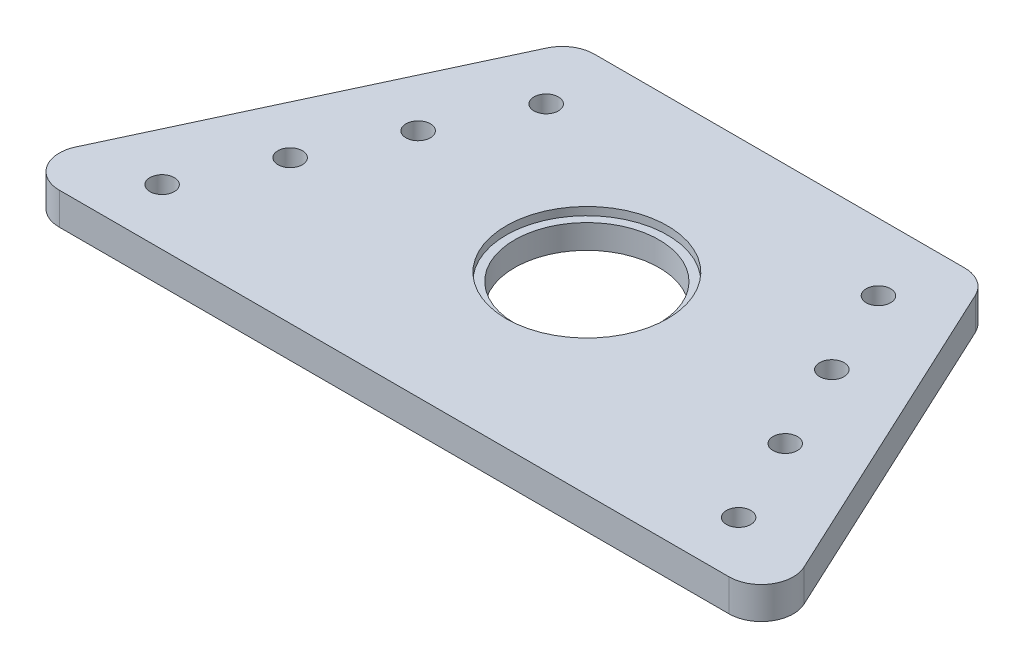
ISO-10303-21;
HEADER;
FILE_DESCRIPTION(('STEP AP214'),'2;1');
FILE_NAME('part.step','',(''),(''),'','','');
FILE_SCHEMA(('AUTOMOTIVE_DESIGN { 1 0 10303 214 1 1 1 1 }'));
ENDSEC;
DATA;
#1=APPLICATION_CONTEXT('core data for automotive mechanical design processes');
#2=APPLICATION_PROTOCOL_DEFINITION('international standard','automotive_design',2000,#1);
#3=PRODUCT_CONTEXT('',#1,'mechanical');
#4=PRODUCT('Part','Part','',(#3));
#5=PRODUCT_RELATED_PRODUCT_CATEGORY('part','',(#4));
#6=PRODUCT_DEFINITION_FORMATION('','',#4);
#7=PRODUCT_DEFINITION_CONTEXT('part definition',#1,'design');
#8=PRODUCT_DEFINITION('design','',#6,#7);
#9=PRODUCT_DEFINITION_SHAPE('','',#8);
#10=(LENGTH_UNIT() NAMED_UNIT(*) SI_UNIT(.MILLI.,.METRE.));
#11=(NAMED_UNIT(*) PLANE_ANGLE_UNIT() SI_UNIT($,.RADIAN.));
#12=(NAMED_UNIT(*) SI_UNIT($,.STERADIAN.) SOLID_ANGLE_UNIT());
#13=UNCERTAINTY_MEASURE_WITH_UNIT(LENGTH_MEASURE(1.E-05),#10,'distance_accuracy_value','');
#14=(GEOMETRIC_REPRESENTATION_CONTEXT(3) GLOBAL_UNCERTAINTY_ASSIGNED_CONTEXT((#13)) GLOBAL_UNIT_ASSIGNED_CONTEXT((#10,
#11,#12)) REPRESENTATION_CONTEXT('',''));
#15=CARTESIAN_POINT('',(0.,0.,0.));
#16=DIRECTION('',(0.,0.,1.));
#17=DIRECTION('',(1.,0.,0.));
#18=AXIS2_PLACEMENT_3D('',#15,#16,#17);
#19=CARTESIAN_POINT('',(0.,6.35,0.));
#20=DIRECTION('',(0.,-1.,0.));
#21=DIRECTION('',(0.,0.,-1.));
#22=AXIS2_PLACEMENT_3D('',#19,#20,#21);
#23=CYLINDRICAL_SURFACE('',#22,14.2875);
#24=CARTESIAN_POINT('',(0.,0.,0.));
#25=DIRECTION('',(0.,1.,0.));
#26=DIRECTION('',(0.,0.,1.));
#27=AXIS2_PLACEMENT_3D('',#24,#25,#26);
#28=CIRCLE('',#27,14.2875);
#29=CARTESIAN_POINT('',(0.,0.,14.2875));
#30=VERTEX_POINT('',#29);
#31=EDGE_CURVE('E130',#30,#30,#28,.T.);
#32=ORIENTED_EDGE('',*,*,#31,.F.);
#33=EDGE_LOOP('',(#32));
#34=FACE_BOUND('',#33,.T.);
#35=CARTESIAN_POINT('',(0.,4.7625,0.));
#36=DIRECTION('',(0.,1.,0.));
#37=DIRECTION('',(0.,0.,1.));
#38=AXIS2_PLACEMENT_3D('',#35,#36,#37);
#39=CIRCLE('',#38,14.2875);
#40=CARTESIAN_POINT('',(0.,4.7625,14.2875));
#41=VERTEX_POINT('',#40);
#42=EDGE_CURVE('E34',#41,#41,#39,.T.);
#43=ORIENTED_EDGE('',*,*,#42,.T.);
#44=EDGE_LOOP('',(#43));
#45=FACE_BOUND('',#44,.T.);
#46=ADVANCED_FACE('F30',(#34,#45),#23,.F.);
#47=CARTESIAN_POINT('',(-40.6673564485887,6.35,-38.1));
#48=DIRECTION('',(0.,-1.,0.));
#49=DIRECTION('',(0.,0.,-1.));
#50=AXIS2_PLACEMENT_3D('',#47,#48,#49);
#51=PLANE('',#50);
#52=CARTESIAN_POINT('',(0.,6.35,0.));
#53=DIRECTION('',(0.,1.,0.));
#54=DIRECTION('',(0.,0.,1.));
#55=AXIS2_PLACEMENT_3D('',#52,#53,#54);
#56=CIRCLE('',#55,15.9385);
#57=CARTESIAN_POINT('',(0.,6.35,15.9385));
#58=VERTEX_POINT('',#57);
#59=EDGE_CURVE('E226',#58,#58,#56,.T.);
#60=ORIENTED_EDGE('',*,*,#59,.F.);
#61=EDGE_LOOP('',(#60));
#62=FACE_BOUND('',#61,.T.);
#63=CARTESIAN_POINT('',(57.0052565779288,6.35,26.9875));
#64=DIRECTION('',(0.,1.,0.));
#65=DIRECTION('',(0.,0.,-1.));
#66=AXIS2_PLACEMENT_3D('',#63,#64,#65);
#67=CIRCLE('',#66,2.413);
#68=CARTESIAN_POINT('',(57.0052565779288,6.35,24.5745));
#69=VERTEX_POINT('',#68);
#70=EDGE_CURVE('E221',#69,#69,#67,.T.);
#71=ORIENTED_EDGE('',*,*,#70,.F.);
#72=EDGE_LOOP('',(#71));
#73=FACE_BOUND('',#72,.T.);
#74=CARTESIAN_POINT('',(48.9543786917679,6.35,9.72233665695194));
#75=DIRECTION('',(0.,1.,0.));
#76=DIRECTION('',(0.,0.,-1.));
#77=AXIS2_PLACEMENT_3D('',#74,#75,#76);
#78=CIRCLE('',#77,2.41299999999999);
#79=CARTESIAN_POINT('',(48.9543786917679,6.35,7.30933665695195));
#80=VERTEX_POINT('',#79);
#81=EDGE_CURVE('E215',#80,#80,#78,.T.);
#82=ORIENTED_EDGE('',*,*,#81,.F.);
#83=EDGE_LOOP('',(#82));
#84=FACE_BOUND('',#83,.T.);
#85=CARTESIAN_POINT('',(40.9035008056075,6.35,-7.5428266860962));
#86=DIRECTION('',(0.,1.,0.));
#87=DIRECTION('',(0.,0.,-1.));
#88=AXIS2_PLACEMENT_3D('',#85,#86,#87);
#89=CIRCLE('',#88,2.41299999999999);
#90=CARTESIAN_POINT('',(40.9035008056075,6.35,-9.9558266860962));
#91=VERTEX_POINT('',#90);
#92=EDGE_CURVE('E209',#91,#91,#89,.T.);
#93=ORIENTED_EDGE('',*,*,#92,.F.);
#94=EDGE_LOOP('',(#93));
#95=FACE_BOUND('',#94,.T.);
#96=CARTESIAN_POINT('',(32.8526229194476,6.35,-24.8079900291445));
#97=DIRECTION('',(0.,1.,0.));
#98=DIRECTION('',(0.,0.,-1.));
#99=AXIS2_PLACEMENT_3D('',#96,#97,#98);
#100=CIRCLE('',#99,2.413);
#101=CARTESIAN_POINT('',(32.8526229194476,6.35,-27.2209900291445));
#102=VERTEX_POINT('',#101);
#103=EDGE_CURVE('E203',#102,#102,#100,.T.);
#104=ORIENTED_EDGE('',*,*,#103,.F.);
#105=EDGE_LOOP('',(#104));
#106=FACE_BOUND('',#105,.T.);
#107=CARTESIAN_POINT('',(-32.8526229194476,6.35,-24.8079900291445));
#108=DIRECTION('',(0.,1.,0.));
#109=DIRECTION('',(0.,0.,1.));
#110=AXIS2_PLACEMENT_3D('',#107,#108,#109);
#111=CIRCLE('',#110,2.41299999999999);
#112=CARTESIAN_POINT('',(-32.8526229194476,6.35,-22.3949900291445));
#113=VERTEX_POINT('',#112);
#114=EDGE_CURVE('E197',#113,#113,#111,.T.);
#115=ORIENTED_EDGE('',*,*,#114,.F.);
#116=EDGE_LOOP('',(#115));
#117=FACE_BOUND('',#116,.T.);
#118=CARTESIAN_POINT('',(-40.9035008056075,6.35,-7.5428266860962));
#119=DIRECTION('',(0.,1.,0.));
#120=DIRECTION('',(0.,0.,1.));
#121=AXIS2_PLACEMENT_3D('',#118,#119,#120);
#122=CIRCLE('',#121,2.41299999999999);
#123=CARTESIAN_POINT('',(-40.9035008056075,6.35,-5.12982668609621));
#124=VERTEX_POINT('',#123);
#125=EDGE_CURVE('E191',#124,#124,#122,.T.);
#126=ORIENTED_EDGE('',*,*,#125,.F.);
#127=EDGE_LOOP('',(#126));
#128=FACE_BOUND('',#127,.T.);
#129=CARTESIAN_POINT('',(-48.9543786917679,6.35,9.72233665695194));
#130=DIRECTION('',(0.,1.,0.));
#131=DIRECTION('',(0.,0.,1.));
#132=AXIS2_PLACEMENT_3D('',#129,#130,#131);
#133=CIRCLE('',#132,2.41299999999999);
#134=CARTESIAN_POINT('',(-48.9543786917679,6.35,12.1353366569519));
#135=VERTEX_POINT('',#134);
#136=EDGE_CURVE('E185',#135,#135,#133,.T.);
#137=ORIENTED_EDGE('',*,*,#136,.F.);
#138=EDGE_LOOP('',(#137));
#139=FACE_BOUND('',#138,.T.);
#140=CARTESIAN_POINT('',(-57.0052565779288,6.35,26.9875));
#141=DIRECTION('',(0.,1.,0.));
#142=DIRECTION('',(0.,0.,1.));
#143=AXIS2_PLACEMENT_3D('',#140,#141,#142);
#144=CIRCLE('',#143,2.413);
#145=CARTESIAN_POINT('',(-57.0052565779288,6.35,29.4005));
#146=VERTEX_POINT('',#145);
#147=EDGE_CURVE('E179',#146,#146,#144,.T.);
#148=ORIENTED_EDGE('',*,*,#147,.F.);
#149=EDGE_LOOP('',(#148));
#150=FACE_BOUND('',#149,.T.);
#151=DIRECTION('',(-0.422618261740703,0.,0.906307787036648));
#152=VECTOR('',#151,1.);
#153=CARTESIAN_POINT('',(-76.2,6.35,38.1));
#154=LINE('',#153,#152);
#155=CARTESIAN_POINT('',(-42.3770147401438,6.35,-34.4336259620535));
#156=VERTEX_POINT('',#155);
#157=CARTESIAN_POINT('',(-71.9875510329866,6.35,29.0663740379465));
#158=VERTEX_POINT('',#157);
#159=EDGE_CURVE('E135',#156,#158,#154,.T.);
#160=ORIENTED_EDGE('',*,*,#159,.T.);
#161=CARTESIAN_POINT('',(-66.2324965853038,6.35,31.75));
#162=DIRECTION('',(0.,-1.,0.));
#163=DIRECTION('',(0.,0.,-1.));
#164=AXIS2_PLACEMENT_3D('',#161,#162,#163);
#165=CIRCLE('',#164,6.35);
#166=CARTESIAN_POINT('',(-66.2324965853038,6.35,38.1));
#167=VERTEX_POINT('',#166);
#168=EDGE_CURVE('E150',#158,#167,#165,.F.);
#169=ORIENTED_EDGE('',*,*,#168,.T.);
#170=DIRECTION('',(1.,0.,0.));
#171=VECTOR('',#170,1.);
#172=CARTESIAN_POINT('',(76.2,6.35,38.1));
#173=LINE('',#172,#171);
#174=CARTESIAN_POINT('',(66.2324965853039,6.35,38.1));
#175=VERTEX_POINT('',#174);
#176=EDGE_CURVE('E117',#167,#175,#173,.T.);
#177=ORIENTED_EDGE('',*,*,#176,.T.);
#178=CARTESIAN_POINT('',(66.2324965853039,6.35,31.75));
#179=DIRECTION('',(0.,-1.,0.));
#180=DIRECTION('',(0.,0.,-1.));
#181=AXIS2_PLACEMENT_3D('',#178,#179,#180);
#182=CIRCLE('',#181,6.35);
#183=CARTESIAN_POINT('',(71.9875510329866,6.35,29.0663740379466));
#184=VERTEX_POINT('',#183);
#185=EDGE_CURVE('E145',#175,#184,#182,.F.);
#186=ORIENTED_EDGE('',*,*,#185,.T.);
#187=DIRECTION('',(-0.422618261740703,0.,-0.906307787036648));
#188=VECTOR('',#187,1.);
#189=CARTESIAN_POINT('',(40.6673564485887,6.35,-38.1));
#190=LINE('',#189,#188);
#191=CARTESIAN_POINT('',(42.3770147401438,6.35,-34.4336259620535));
#192=VERTEX_POINT('',#191);
#193=EDGE_CURVE('E162',#184,#192,#190,.T.);
#194=ORIENTED_EDGE('',*,*,#193,.T.);
#195=CARTESIAN_POINT('',(36.6219602924611,6.35,-31.75));
#196=DIRECTION('',(0.,-1.,0.));
#197=DIRECTION('',(0.,0.,-1.));
#198=AXIS2_PLACEMENT_3D('',#195,#196,#197);
#199=CIRCLE('',#198,6.35);
#200=CARTESIAN_POINT('',(36.6219602924611,6.35,-38.1));
#201=VERTEX_POINT('',#200);
#202=EDGE_CURVE('E53',#192,#201,#199,.F.);
#203=ORIENTED_EDGE('',*,*,#202,.T.);
#204=DIRECTION('',(-1.,0.,0.));
#205=VECTOR('',#204,1.);
#206=CARTESIAN_POINT('',(-40.6673564485887,6.35,-38.1));
#207=LINE('',#206,#205);
#208=CARTESIAN_POINT('',(-36.6219602924611,6.35,-38.1));
#209=VERTEX_POINT('',#208);
#210=EDGE_CURVE('E136',#201,#209,#207,.T.);
#211=ORIENTED_EDGE('',*,*,#210,.T.);
#212=CARTESIAN_POINT('',(-36.6219602924611,6.35,-31.75));
#213=DIRECTION('',(0.,-1.,0.));
#214=DIRECTION('',(0.,0.,-1.));
#215=AXIS2_PLACEMENT_3D('',#212,#213,#214);
#216=CIRCLE('',#215,6.35);
#217=EDGE_CURVE('E148',#209,#156,#216,.F.);
#218=ORIENTED_EDGE('',*,*,#217,.T.);
#219=EDGE_LOOP('',(#160,#169,#177,#186,#194,#203,#211,#218));
#220=FACE_BOUND('',#219,.T.);
#221=ADVANCED_FACE('F247',(#62,#73,#84,#95,#106,#117,#128,#139,#150,#220),#51,.F.);
#222=CARTESIAN_POINT('',(-40.6673564485887,0.,-38.1));
#223=DIRECTION('',(0.,-1.,0.));
#224=DIRECTION('',(0.,0.,-1.));
#225=AXIS2_PLACEMENT_3D('',#222,#223,#224);
#226=PLANE('',#225);
#227=CARTESIAN_POINT('',(57.0052565779288,0.,26.9875));
#228=DIRECTION('',(0.,1.,0.));
#229=DIRECTION('',(0.,0.,-1.));
#230=AXIS2_PLACEMENT_3D('',#227,#228,#229);
#231=CIRCLE('',#230,2.413);
#232=CARTESIAN_POINT('',(57.0052565779288,0.,24.5745));
#233=VERTEX_POINT('',#232);
#234=EDGE_CURVE('E218',#233,#233,#231,.T.);
#235=ORIENTED_EDGE('',*,*,#234,.T.);
#236=EDGE_LOOP('',(#235));
#237=FACE_BOUND('',#236,.T.);
#238=CARTESIAN_POINT('',(48.9543786917679,0.,9.72233665695194));
#239=DIRECTION('',(0.,1.,0.));
#240=DIRECTION('',(0.,0.,-1.));
#241=AXIS2_PLACEMENT_3D('',#238,#239,#240);
#242=CIRCLE('',#241,2.41299999999999);
#243=CARTESIAN_POINT('',(48.9543786917679,0.,7.30933665695195));
#244=VERTEX_POINT('',#243);
#245=EDGE_CURVE('E212',#244,#244,#242,.T.);
#246=ORIENTED_EDGE('',*,*,#245,.T.);
#247=EDGE_LOOP('',(#246));
#248=FACE_BOUND('',#247,.T.);
#249=CARTESIAN_POINT('',(40.9035008056075,0.,-7.5428266860962));
#250=DIRECTION('',(0.,1.,0.));
#251=DIRECTION('',(0.,0.,-1.));
#252=AXIS2_PLACEMENT_3D('',#249,#250,#251);
#253=CIRCLE('',#252,2.41299999999999);
#254=CARTESIAN_POINT('',(40.9035008056075,0.,-9.9558266860962));
#255=VERTEX_POINT('',#254);
#256=EDGE_CURVE('E206',#255,#255,#253,.T.);
#257=ORIENTED_EDGE('',*,*,#256,.T.);
#258=EDGE_LOOP('',(#257));
#259=FACE_BOUND('',#258,.T.);
#260=CARTESIAN_POINT('',(32.8526229194476,0.,-24.8079900291445));
#261=DIRECTION('',(0.,1.,0.));
#262=DIRECTION('',(0.,0.,-1.));
#263=AXIS2_PLACEMENT_3D('',#260,#261,#262);
#264=CIRCLE('',#263,2.413);
#265=CARTESIAN_POINT('',(32.8526229194476,0.,-27.2209900291445));
#266=VERTEX_POINT('',#265);
#267=EDGE_CURVE('E200',#266,#266,#264,.T.);
#268=ORIENTED_EDGE('',*,*,#267,.T.);
#269=EDGE_LOOP('',(#268));
#270=FACE_BOUND('',#269,.T.);
#271=CARTESIAN_POINT('',(-32.8526229194476,0.,-24.8079900291445));
#272=DIRECTION('',(0.,1.,0.));
#273=DIRECTION('',(0.,0.,1.));
#274=AXIS2_PLACEMENT_3D('',#271,#272,#273);
#275=CIRCLE('',#274,2.41299999999999);
#276=CARTESIAN_POINT('',(-32.8526229194476,0.,-22.3949900291445));
#277=VERTEX_POINT('',#276);
#278=EDGE_CURVE('E194',#277,#277,#275,.T.);
#279=ORIENTED_EDGE('',*,*,#278,.T.);
#280=EDGE_LOOP('',(#279));
#281=FACE_BOUND('',#280,.T.);
#282=CARTESIAN_POINT('',(-40.9035008056075,0.,-7.5428266860962));
#283=DIRECTION('',(0.,1.,0.));
#284=DIRECTION('',(0.,0.,1.));
#285=AXIS2_PLACEMENT_3D('',#282,#283,#284);
#286=CIRCLE('',#285,2.41299999999999);
#287=CARTESIAN_POINT('',(-40.9035008056075,0.,-5.12982668609621));
#288=VERTEX_POINT('',#287);
#289=EDGE_CURVE('E188',#288,#288,#286,.T.);
#290=ORIENTED_EDGE('',*,*,#289,.T.);
#291=EDGE_LOOP('',(#290));
#292=FACE_BOUND('',#291,.T.);
#293=CARTESIAN_POINT('',(-48.9543786917679,0.,9.72233665695194));
#294=DIRECTION('',(0.,1.,0.));
#295=DIRECTION('',(0.,0.,1.));
#296=AXIS2_PLACEMENT_3D('',#293,#294,#295);
#297=CIRCLE('',#296,2.41299999999999);
#298=CARTESIAN_POINT('',(-48.9543786917679,0.,12.1353366569519));
#299=VERTEX_POINT('',#298);
#300=EDGE_CURVE('E182',#299,#299,#297,.T.);
#301=ORIENTED_EDGE('',*,*,#300,.T.);
#302=EDGE_LOOP('',(#301));
#303=FACE_BOUND('',#302,.T.);
#304=CARTESIAN_POINT('',(-57.0052565779288,0.,26.9875));
#305=DIRECTION('',(0.,1.,0.));
#306=DIRECTION('',(0.,0.,1.));
#307=AXIS2_PLACEMENT_3D('',#304,#305,#306);
#308=CIRCLE('',#307,2.413);
#309=CARTESIAN_POINT('',(-57.0052565779288,0.,29.4005));
#310=VERTEX_POINT('',#309);
#311=EDGE_CURVE('E178',#310,#310,#308,.T.);
#312=ORIENTED_EDGE('',*,*,#311,.T.);
#313=EDGE_LOOP('',(#312));
#314=FACE_BOUND('',#313,.T.);
#315=DIRECTION('',(1.,0.,0.));
#316=VECTOR('',#315,1.);
#317=CARTESIAN_POINT('',(76.2,0.,38.1));
#318=LINE('',#317,#316);
#319=CARTESIAN_POINT('',(-66.2324965853038,0.,38.1));
#320=VERTEX_POINT('',#319);
#321=CARTESIAN_POINT('',(66.2324965853039,0.,38.1));
#322=VERTEX_POINT('',#321);
#323=EDGE_CURVE('E114',#320,#322,#318,.T.);
#324=ORIENTED_EDGE('',*,*,#323,.F.);
#325=CARTESIAN_POINT('',(-66.2324965853038,0.,31.75));
#326=DIRECTION('',(0.,-1.,0.));
#327=DIRECTION('',(0.,0.,-1.));
#328=AXIS2_PLACEMENT_3D('',#325,#326,#327);
#329=CIRCLE('',#328,6.35);
#330=CARTESIAN_POINT('',(-71.9875510329866,0.,29.0663740379465));
#331=VERTEX_POINT('',#330);
#332=EDGE_CURVE('E97',#320,#331,#329,.T.);
#333=ORIENTED_EDGE('',*,*,#332,.T.);
#334=DIRECTION('',(-0.422618261740703,0.,0.906307787036648));
#335=VECTOR('',#334,1.);
#336=CARTESIAN_POINT('',(-76.2,0.,38.1));
#337=LINE('',#336,#335);
#338=CARTESIAN_POINT('',(-42.3770147401438,0.,-34.4336259620535));
#339=VERTEX_POINT('',#338);
#340=EDGE_CURVE('E125',#339,#331,#337,.T.);
#341=ORIENTED_EDGE('',*,*,#340,.F.);
#342=CARTESIAN_POINT('',(-36.6219602924611,0.,-31.75));
#343=DIRECTION('',(0.,-1.,0.));
#344=DIRECTION('',(0.,0.,-1.));
#345=AXIS2_PLACEMENT_3D('',#342,#343,#344);
#346=CIRCLE('',#345,6.35);
#347=CARTESIAN_POINT('',(-36.6219602924611,0.,-38.1));
#348=VERTEX_POINT('',#347);
#349=EDGE_CURVE('E108',#339,#348,#346,.T.);
#350=ORIENTED_EDGE('',*,*,#349,.T.);
#351=DIRECTION('',(-1.,0.,0.));
#352=VECTOR('',#351,1.);
#353=CARTESIAN_POINT('',(-40.6673564485887,0.,-38.1));
#354=LINE('',#353,#352);
#355=CARTESIAN_POINT('',(36.6219602924611,0.,-38.1));
#356=VERTEX_POINT('',#355);
#357=EDGE_CURVE('E128',#356,#348,#354,.T.);
#358=ORIENTED_EDGE('',*,*,#357,.F.);
#359=CARTESIAN_POINT('',(36.6219602924611,0.,-31.75));
#360=DIRECTION('',(0.,-1.,0.));
#361=DIRECTION('',(0.,0.,-1.));
#362=AXIS2_PLACEMENT_3D('',#359,#360,#361);
#363=CIRCLE('',#362,6.35);
#364=CARTESIAN_POINT('',(42.3770147401438,0.,-34.4336259620535));
#365=VERTEX_POINT('',#364);
#366=EDGE_CURVE('E139',#356,#365,#363,.T.);
#367=ORIENTED_EDGE('',*,*,#366,.T.);
#368=DIRECTION('',(-0.422618261740703,0.,-0.906307787036648));
#369=VECTOR('',#368,1.);
#370=CARTESIAN_POINT('',(40.6673564485887,0.,-38.1));
#371=LINE('',#370,#369);
#372=CARTESIAN_POINT('',(71.9875510329866,0.,29.0663740379466));
#373=VERTEX_POINT('',#372);
#374=EDGE_CURVE('E124',#373,#365,#371,.T.);
#375=ORIENTED_EDGE('',*,*,#374,.F.);
#376=CARTESIAN_POINT('',(66.2324965853039,0.,31.75));
#377=DIRECTION('',(0.,-1.,0.));
#378=DIRECTION('',(0.,0.,-1.));
#379=AXIS2_PLACEMENT_3D('',#376,#377,#378);
#380=CIRCLE('',#379,6.35);
#381=EDGE_CURVE('E118',#373,#322,#380,.T.);
#382=ORIENTED_EDGE('',*,*,#381,.T.);
#383=EDGE_LOOP('',(#324,#333,#341,#350,#358,#367,#375,#382));
#384=FACE_BOUND('',#383,.T.);
#385=ORIENTED_EDGE('',*,*,#31,.T.);
#386=EDGE_LOOP('',(#385));
#387=FACE_BOUND('',#386,.T.);
#388=ADVANCED_FACE('F121',(#237,#248,#259,#270,#281,#292,#303,#314,#384,#387),#226,.T.);
#389=CARTESIAN_POINT('',(-76.2,6.35,38.1));
#390=DIRECTION('',(0.906307787036648,0.,0.422618261740703));
#391=DIRECTION('',(0.422618261740704,0.,-0.906307787036648));
#392=AXIS2_PLACEMENT_3D('',#389,#390,#391);
#393=PLANE('',#392);
#394=ORIENTED_EDGE('',*,*,#340,.T.);
#395=DIRECTION('',(0.,-1.,0.));
#396=VECTOR('',#395,1.);
#397=CARTESIAN_POINT('',(-71.9875510329866,6.35,29.0663740379465));
#398=LINE('',#397,#396);
#399=EDGE_CURVE('E102',#331,#158,#398,.F.);
#400=ORIENTED_EDGE('',*,*,#399,.T.);
#401=ORIENTED_EDGE('',*,*,#159,.F.);
#402=DIRECTION('',(0.,-1.,0.));
#403=VECTOR('',#402,1.);
#404=CARTESIAN_POINT('',(-42.3770147401438,6.35,-34.4336259620535));
#405=LINE('',#404,#403);
#406=EDGE_CURVE('E107',#156,#339,#405,.T.);
#407=ORIENTED_EDGE('',*,*,#406,.T.);
#408=EDGE_LOOP('',(#394,#400,#401,#407));
#409=FACE_BOUND('',#408,.T.);
#410=ADVANCED_FACE('F262',(#409),#393,.F.);
#411=CARTESIAN_POINT('',(76.2,6.35,38.1));
#412=DIRECTION('',(0.,0.,-1.));
#413=DIRECTION('',(-1.,0.,0.));
#414=AXIS2_PLACEMENT_3D('',#411,#412,#413);
#415=PLANE('',#414);
#416=ORIENTED_EDGE('',*,*,#176,.F.);
#417=DIRECTION('',(0.,-1.,0.));
#418=VECTOR('',#417,1.);
#419=CARTESIAN_POINT('',(-66.2324965853038,6.35,38.1));
#420=LINE('',#419,#418);
#421=EDGE_CURVE('E101',#167,#320,#420,.T.);
#422=ORIENTED_EDGE('',*,*,#421,.T.);
#423=ORIENTED_EDGE('',*,*,#323,.T.);
#424=DIRECTION('',(0.,-1.,0.));
#425=VECTOR('',#424,1.);
#426=CARTESIAN_POINT('',(66.2324965853039,6.35,38.1));
#427=LINE('',#426,#425);
#428=EDGE_CURVE('E119',#322,#175,#427,.F.);
#429=ORIENTED_EDGE('',*,*,#428,.T.);
#430=EDGE_LOOP('',(#416,#422,#423,#429));
#431=FACE_BOUND('',#430,.T.);
#432=ADVANCED_FACE('F113',(#431),#415,.F.);
#433=CARTESIAN_POINT('',(40.6673564485887,6.35,-38.1));
#434=DIRECTION('',(-0.906307787036648,0.,0.422618261740703));
#435=DIRECTION('',(0.422618261740703,0.,0.906307787036648));
#436=AXIS2_PLACEMENT_3D('',#433,#434,#435);
#437=PLANE('',#436);
#438=ORIENTED_EDGE('',*,*,#374,.T.);
#439=DIRECTION('',(0.,-1.,0.));
#440=VECTOR('',#439,1.);
#441=CARTESIAN_POINT('',(42.3770147401438,6.35,-34.4336259620535));
#442=LINE('',#441,#440);
#443=EDGE_CURVE('E11',#365,#192,#442,.F.);
#444=ORIENTED_EDGE('',*,*,#443,.T.);
#445=ORIENTED_EDGE('',*,*,#193,.F.);
#446=DIRECTION('',(0.,-1.,0.));
#447=VECTOR('',#446,1.);
#448=CARTESIAN_POINT('',(71.9875510329866,6.35,29.0663740379466));
#449=LINE('',#448,#447);
#450=EDGE_CURVE('E39',#184,#373,#449,.T.);
#451=ORIENTED_EDGE('',*,*,#450,.T.);
#452=EDGE_LOOP('',(#438,#444,#445,#451));
#453=FACE_BOUND('',#452,.T.);
#454=ADVANCED_FACE('F160',(#453),#437,.F.);
#455=CARTESIAN_POINT('',(-40.6673564485887,6.35,-38.1));
#456=DIRECTION('',(0.,0.,1.));
#457=DIRECTION('',(1.,0.,0.));
#458=AXIS2_PLACEMENT_3D('',#455,#456,#457);
#459=PLANE('',#458);
#460=ORIENTED_EDGE('',*,*,#357,.T.);
#461=DIRECTION('',(0.,-1.,0.));
#462=VECTOR('',#461,1.);
#463=CARTESIAN_POINT('',(-36.6219602924611,6.35,-38.1));
#464=LINE('',#463,#462);
#465=EDGE_CURVE('E46',#348,#209,#464,.F.);
#466=ORIENTED_EDGE('',*,*,#465,.T.);
#467=ORIENTED_EDGE('',*,*,#210,.F.);
#468=DIRECTION('',(0.,-1.,0.));
#469=VECTOR('',#468,1.);
#470=CARTESIAN_POINT('',(36.6219602924611,6.35,-38.1));
#471=LINE('',#470,#469);
#472=EDGE_CURVE('E152',#201,#356,#471,.T.);
#473=ORIENTED_EDGE('',*,*,#472,.T.);
#474=EDGE_LOOP('',(#460,#466,#467,#473));
#475=FACE_BOUND('',#474,.T.);
#476=ADVANCED_FACE('F169',(#475),#459,.F.);
#477=CARTESIAN_POINT('',(-57.0052565779288,0.,26.9875));
#478=DIRECTION('',(0.,1.,0.));
#479=DIRECTION('',(0.,0.,1.));
#480=AXIS2_PLACEMENT_3D('',#477,#478,#479);
#481=CYLINDRICAL_SURFACE('',#480,2.413);
#482=ORIENTED_EDGE('',*,*,#311,.F.);
#483=EDGE_LOOP('',(#482));
#484=FACE_BOUND('',#483,.T.);
#485=ORIENTED_EDGE('',*,*,#147,.T.);
#486=EDGE_LOOP('',(#485));
#487=FACE_BOUND('',#486,.T.);
#488=ADVANCED_FACE('F257',(#484,#487),#481,.F.);
#489=CARTESIAN_POINT('',(-48.9543786917679,0.,9.72233665695194));
#490=DIRECTION('',(0.,1.,0.));
#491=DIRECTION('',(0.,0.,1.));
#492=AXIS2_PLACEMENT_3D('',#489,#490,#491);
#493=CYLINDRICAL_SURFACE('',#492,2.41299999999999);
#494=ORIENTED_EDGE('',*,*,#300,.F.);
#495=EDGE_LOOP('',(#494));
#496=FACE_BOUND('',#495,.T.);
#497=ORIENTED_EDGE('',*,*,#136,.T.);
#498=EDGE_LOOP('',(#497));
#499=FACE_BOUND('',#498,.T.);
#500=ADVANCED_FACE('F379',(#496,#499),#493,.F.);
#501=CARTESIAN_POINT('',(-40.9035008056075,0.,-7.5428266860962));
#502=DIRECTION('',(0.,1.,0.));
#503=DIRECTION('',(0.,0.,1.));
#504=AXIS2_PLACEMENT_3D('',#501,#502,#503);
#505=CYLINDRICAL_SURFACE('',#504,2.41299999999999);
#506=ORIENTED_EDGE('',*,*,#289,.F.);
#507=EDGE_LOOP('',(#506));
#508=FACE_BOUND('',#507,.T.);
#509=ORIENTED_EDGE('',*,*,#125,.T.);
#510=EDGE_LOOP('',(#509));
#511=FACE_BOUND('',#510,.T.);
#512=ADVANCED_FACE('F370',(#508,#511),#505,.F.);
#513=CARTESIAN_POINT('',(-32.8526229194476,0.,-24.8079900291445));
#514=DIRECTION('',(0.,1.,0.));
#515=DIRECTION('',(0.,0.,1.));
#516=AXIS2_PLACEMENT_3D('',#513,#514,#515);
#517=CYLINDRICAL_SURFACE('',#516,2.41299999999999);
#518=ORIENTED_EDGE('',*,*,#278,.F.);
#519=EDGE_LOOP('',(#518));
#520=FACE_BOUND('',#519,.T.);
#521=ORIENTED_EDGE('',*,*,#114,.T.);
#522=EDGE_LOOP('',(#521));
#523=FACE_BOUND('',#522,.T.);
#524=ADVANCED_FACE('F361',(#520,#523),#517,.F.);
#525=CARTESIAN_POINT('',(32.8526229194476,0.,-24.8079900291445));
#526=DIRECTION('',(0.,1.,0.));
#527=DIRECTION('',(0.,0.,1.));
#528=AXIS2_PLACEMENT_3D('',#525,#526,#527);
#529=CYLINDRICAL_SURFACE('',#528,2.413);
#530=ORIENTED_EDGE('',*,*,#267,.F.);
#531=EDGE_LOOP('',(#530));
#532=FACE_BOUND('',#531,.T.);
#533=ORIENTED_EDGE('',*,*,#103,.T.);
#534=EDGE_LOOP('',(#533));
#535=FACE_BOUND('',#534,.T.);
#536=ADVANCED_FACE('F352',(#532,#535),#529,.F.);
#537=CARTESIAN_POINT('',(40.9035008056075,0.,-7.5428266860962));
#538=DIRECTION('',(0.,1.,0.));
#539=DIRECTION('',(0.,0.,1.));
#540=AXIS2_PLACEMENT_3D('',#537,#538,#539);
#541=CYLINDRICAL_SURFACE('',#540,2.41299999999999);
#542=ORIENTED_EDGE('',*,*,#256,.F.);
#543=EDGE_LOOP('',(#542));
#544=FACE_BOUND('',#543,.T.);
#545=ORIENTED_EDGE('',*,*,#92,.T.);
#546=EDGE_LOOP('',(#545));
#547=FACE_BOUND('',#546,.T.);
#548=ADVANCED_FACE('F343',(#544,#547),#541,.F.);
#549=CARTESIAN_POINT('',(48.9543786917679,0.,9.72233665695194));
#550=DIRECTION('',(0.,1.,0.));
#551=DIRECTION('',(0.,0.,1.));
#552=AXIS2_PLACEMENT_3D('',#549,#550,#551);
#553=CYLINDRICAL_SURFACE('',#552,2.41299999999999);
#554=ORIENTED_EDGE('',*,*,#245,.F.);
#555=EDGE_LOOP('',(#554));
#556=FACE_BOUND('',#555,.T.);
#557=ORIENTED_EDGE('',*,*,#81,.T.);
#558=EDGE_LOOP('',(#557));
#559=FACE_BOUND('',#558,.T.);
#560=ADVANCED_FACE('F333',(#556,#559),#553,.F.);
#561=CARTESIAN_POINT('',(57.0052565779288,0.,26.9875));
#562=DIRECTION('',(0.,1.,0.));
#563=DIRECTION('',(0.,0.,1.));
#564=AXIS2_PLACEMENT_3D('',#561,#562,#563);
#565=CYLINDRICAL_SURFACE('',#564,2.413);
#566=ORIENTED_EDGE('',*,*,#234,.F.);
#567=EDGE_LOOP('',(#566));
#568=FACE_BOUND('',#567,.T.);
#569=ORIENTED_EDGE('',*,*,#70,.T.);
#570=EDGE_LOOP('',(#569));
#571=FACE_BOUND('',#570,.T.);
#572=ADVANCED_FACE('F276',(#568,#571),#565,.F.);
#573=CARTESIAN_POINT('',(-66.2324965853038,6.35,31.75));
#574=DIRECTION('',(0.,-1.,0.));
#575=DIRECTION('',(0.,0.,-1.));
#576=AXIS2_PLACEMENT_3D('',#573,#574,#575);
#577=CYLINDRICAL_SURFACE('',#576,6.35);
#578=ORIENTED_EDGE('',*,*,#168,.F.);
#579=ORIENTED_EDGE('',*,*,#399,.F.);
#580=ORIENTED_EDGE('',*,*,#332,.F.);
#581=ORIENTED_EDGE('',*,*,#421,.F.);
#582=EDGE_LOOP('',(#578,#579,#580,#581));
#583=FACE_BOUND('',#582,.T.);
#584=ADVANCED_FACE('F100',(#583),#577,.T.);
#585=CARTESIAN_POINT('',(-36.6219602924611,6.35,-31.75));
#586=DIRECTION('',(0.,-1.,0.));
#587=DIRECTION('',(0.,0.,-1.));
#588=AXIS2_PLACEMENT_3D('',#585,#586,#587);
#589=CYLINDRICAL_SURFACE('',#588,6.35);
#590=ORIENTED_EDGE('',*,*,#217,.F.);
#591=ORIENTED_EDGE('',*,*,#465,.F.);
#592=ORIENTED_EDGE('',*,*,#349,.F.);
#593=ORIENTED_EDGE('',*,*,#406,.F.);
#594=EDGE_LOOP('',(#590,#591,#592,#593));
#595=FACE_BOUND('',#594,.T.);
#596=ADVANCED_FACE('F275',(#595),#589,.T.);
#597=CARTESIAN_POINT('',(36.6219602924611,6.35,-31.75));
#598=DIRECTION('',(0.,-1.,0.));
#599=DIRECTION('',(0.,0.,-1.));
#600=AXIS2_PLACEMENT_3D('',#597,#598,#599);
#601=CYLINDRICAL_SURFACE('',#600,6.35);
#602=ORIENTED_EDGE('',*,*,#202,.F.);
#603=ORIENTED_EDGE('',*,*,#443,.F.);
#604=ORIENTED_EDGE('',*,*,#366,.F.);
#605=ORIENTED_EDGE('',*,*,#472,.F.);
#606=EDGE_LOOP('',(#602,#603,#604,#605));
#607=FACE_BOUND('',#606,.T.);
#608=ADVANCED_FACE('F168',(#607),#601,.T.);
#609=CARTESIAN_POINT('',(66.2324965853039,6.35,31.75));
#610=DIRECTION('',(0.,-1.,0.));
#611=DIRECTION('',(0.,0.,-1.));
#612=AXIS2_PLACEMENT_3D('',#609,#610,#611);
#613=CYLINDRICAL_SURFACE('',#612,6.35);
#614=ORIENTED_EDGE('',*,*,#185,.F.);
#615=ORIENTED_EDGE('',*,*,#428,.F.);
#616=ORIENTED_EDGE('',*,*,#381,.F.);
#617=ORIENTED_EDGE('',*,*,#450,.F.);
#618=EDGE_LOOP('',(#614,#615,#616,#617));
#619=FACE_BOUND('',#618,.T.);
#620=ADVANCED_FACE('F32',(#619),#613,.T.);
#621=CARTESIAN_POINT('',(0.,4.7625,0.));
#622=DIRECTION('',(0.,1.,0.));
#623=DIRECTION('',(0.,0.,1.));
#624=AXIS2_PLACEMENT_3D('',#621,#622,#623);
#625=CYLINDRICAL_SURFACE('',#624,15.9385);
#626=CARTESIAN_POINT('',(0.,4.7625,0.));
#627=DIRECTION('',(0.,1.,0.));
#628=DIRECTION('',(0.,0.,1.));
#629=AXIS2_PLACEMENT_3D('',#626,#627,#628);
#630=CIRCLE('',#629,15.9385);
#631=CARTESIAN_POINT('',(0.,4.7625,15.9385));
#632=VERTEX_POINT('',#631);
#633=EDGE_CURVE('E229',#632,#632,#630,.T.);
#634=ORIENTED_EDGE('',*,*,#633,.F.);
#635=EDGE_LOOP('',(#634));
#636=FACE_BOUND('',#635,.T.);
#637=ORIENTED_EDGE('',*,*,#59,.T.);
#638=EDGE_LOOP('',(#637));
#639=FACE_BOUND('',#638,.T.);
#640=ADVANCED_FACE('F239',(#636,#639),#625,.F.);
#641=CARTESIAN_POINT('',(0.,4.7625,0.));
#642=DIRECTION('',(0.,1.,0.));
#643=DIRECTION('',(0.,0.,1.));
#644=AXIS2_PLACEMENT_3D('',#641,#642,#643);
#645=PLANE('',#644);
#646=ORIENTED_EDGE('',*,*,#42,.F.);
#647=EDGE_LOOP('',(#646));
#648=FACE_BOUND('',#647,.T.);
#649=ORIENTED_EDGE('',*,*,#633,.T.);
#650=EDGE_LOOP('',(#649));
#651=FACE_BOUND('',#650,.T.);
#652=ADVANCED_FACE('F237',(#648,#651),#645,.T.);
#653=CLOSED_SHELL('',(#46,#221,#388,#410,#432,#454,#476,#488,#500,#512,#524,#536,#548,#560,#572,
#584,#596,#608,#620,#640,#652));
#654=MANIFOLD_SOLID_BREP('B2',#653);
#655=ADVANCED_BREP_SHAPE_REPRESENTATION('',(#18,#654),#14);
#656=SHAPE_DEFINITION_REPRESENTATION(#9,#655);
ENDSEC;
END-ISO-10303-21;
